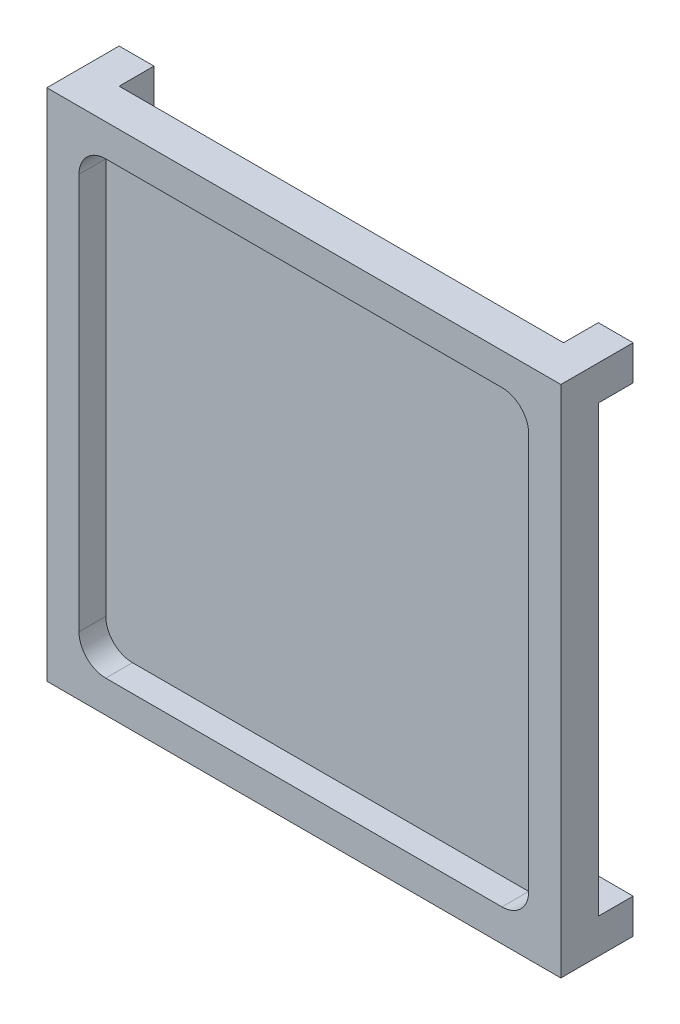
ISO-10303-21;
HEADER;
FILE_DESCRIPTION(('STEP AP214'),'2;1');
FILE_NAME('part.step','',(''),(''),'','','');
FILE_SCHEMA(('AUTOMOTIVE_DESIGN { 1 0 10303 214 1 1 1 1 }'));
ENDSEC;
DATA;
#1=APPLICATION_CONTEXT('core data for automotive mechanical design processes');
#2=APPLICATION_PROTOCOL_DEFINITION('international standard','automotive_design',2000,#1);
#3=PRODUCT_CONTEXT('',#1,'mechanical');
#4=PRODUCT('Part','Part','',(#3));
#5=PRODUCT_RELATED_PRODUCT_CATEGORY('part','',(#4));
#6=PRODUCT_DEFINITION_FORMATION('','',#4);
#7=PRODUCT_DEFINITION_CONTEXT('part definition',#1,'design');
#8=PRODUCT_DEFINITION('design','',#6,#7);
#9=PRODUCT_DEFINITION_SHAPE('','',#8);
#10=(LENGTH_UNIT() NAMED_UNIT(*) SI_UNIT(.MILLI.,.METRE.));
#11=(NAMED_UNIT(*) PLANE_ANGLE_UNIT() SI_UNIT($,.RADIAN.));
#12=(NAMED_UNIT(*) SI_UNIT($,.STERADIAN.) SOLID_ANGLE_UNIT());
#13=UNCERTAINTY_MEASURE_WITH_UNIT(LENGTH_MEASURE(1.E-05),#10,'distance_accuracy_value','');
#14=(GEOMETRIC_REPRESENTATION_CONTEXT(3) GLOBAL_UNCERTAINTY_ASSIGNED_CONTEXT((#13)) GLOBAL_UNIT_ASSIGNED_CONTEXT((#10,
#11,#12)) REPRESENTATION_CONTEXT('',''));
#15=CARTESIAN_POINT('',(0.,0.,0.));
#16=DIRECTION('',(0.,0.,1.));
#17=DIRECTION('',(1.,0.,0.));
#18=AXIS2_PLACEMENT_3D('',#15,#16,#17);
#19=CARTESIAN_POINT('',(0.,0.,0.));
#20=DIRECTION('',(0.,0.,1.));
#21=DIRECTION('',(1.,0.,0.));
#22=AXIS2_PLACEMENT_3D('',#19,#20,#21);
#23=PLANE('',#22);
#24=DIRECTION('',(1.,0.,0.));
#25=VECTOR('',#24,1.);
#26=CARTESIAN_POINT('',(-48.,-41.5,0.));
#27=LINE('',#26,#25);
#28=CARTESIAN_POINT('',(-48.,-41.5,0.));
#29=VERTEX_POINT('',#28);
#30=CARTESIAN_POINT('',(-41.5,-41.5,0.));
#31=VERTEX_POINT('',#30);
#32=EDGE_CURVE('E424',#29,#31,#27,.T.);
#33=ORIENTED_EDGE('',*,*,#32,.F.);
#34=DIRECTION('',(0.,-1.,0.));
#35=VECTOR('',#34,1.);
#36=CARTESIAN_POINT('',(-48.,-48.,0.));
#37=LINE('',#36,#35);
#38=CARTESIAN_POINT('',(-48.,41.5,0.));
#39=VERTEX_POINT('',#38);
#40=EDGE_CURVE('E225',#39,#29,#37,.T.);
#41=ORIENTED_EDGE('',*,*,#40,.F.);
#42=DIRECTION('',(-1.,0.,0.));
#43=VECTOR('',#42,1.);
#44=CARTESIAN_POINT('',(-48.,41.5,0.));
#45=LINE('',#44,#43);
#46=CARTESIAN_POINT('',(-41.5,41.5,0.));
#47=VERTEX_POINT('',#46);
#48=EDGE_CURVE('E255',#47,#39,#45,.T.);
#49=ORIENTED_EDGE('',*,*,#48,.F.);
#50=DIRECTION('',(0.,-1.,0.));
#51=VECTOR('',#50,1.);
#52=CARTESIAN_POINT('',(-41.5,48.,0.));
#53=LINE('',#52,#51);
#54=CARTESIAN_POINT('',(-41.5,48.,0.));
#55=VERTEX_POINT('',#54);
#56=EDGE_CURVE('E250',#55,#47,#53,.T.);
#57=ORIENTED_EDGE('',*,*,#56,.F.);
#58=DIRECTION('',(-1.,0.,0.));
#59=VECTOR('',#58,1.);
#60=CARTESIAN_POINT('',(48.,48.,0.));
#61=LINE('',#60,#59);
#62=CARTESIAN_POINT('',(41.5,48.,0.));
#63=VERTEX_POINT('',#62);
#64=EDGE_CURVE('E369',#63,#55,#61,.T.);
#65=ORIENTED_EDGE('',*,*,#64,.F.);
#66=DIRECTION('',(0.,1.,0.));
#67=VECTOR('',#66,1.);
#68=CARTESIAN_POINT('',(41.5,48.,0.));
#69=LINE('',#68,#67);
#70=CARTESIAN_POINT('',(41.5,41.5,0.));
#71=VERTEX_POINT('',#70);
#72=EDGE_CURVE('E275',#71,#63,#69,.T.);
#73=ORIENTED_EDGE('',*,*,#72,.F.);
#74=DIRECTION('',(-1.,0.,0.));
#75=VECTOR('',#74,1.);
#76=CARTESIAN_POINT('',(48.,41.5,0.));
#77=LINE('',#76,#75);
#78=CARTESIAN_POINT('',(48.,41.5,0.));
#79=VERTEX_POINT('',#78);
#80=EDGE_CURVE('E270',#79,#71,#77,.T.);
#81=ORIENTED_EDGE('',*,*,#80,.F.);
#82=DIRECTION('',(0.,1.,0.));
#83=VECTOR('',#82,1.);
#84=CARTESIAN_POINT('',(48.,-48.,0.));
#85=LINE('',#84,#83);
#86=CARTESIAN_POINT('',(48.,-41.5,0.));
#87=VERTEX_POINT('',#86);
#88=EDGE_CURVE('E367',#87,#79,#85,.T.);
#89=ORIENTED_EDGE('',*,*,#88,.F.);
#90=DIRECTION('',(1.,0.,0.));
#91=VECTOR('',#90,1.);
#92=CARTESIAN_POINT('',(48.,-41.5,0.));
#93=LINE('',#92,#91);
#94=CARTESIAN_POINT('',(41.5,-41.5,0.));
#95=VERTEX_POINT('',#94);
#96=EDGE_CURVE('E228',#95,#87,#93,.T.);
#97=ORIENTED_EDGE('',*,*,#96,.F.);
#98=DIRECTION('',(0.,1.,0.));
#99=VECTOR('',#98,1.);
#100=CARTESIAN_POINT('',(41.5,-48.,0.));
#101=LINE('',#100,#99);
#102=CARTESIAN_POINT('',(41.5,-48.,0.));
#103=VERTEX_POINT('',#102);
#104=EDGE_CURVE('E226',#103,#95,#101,.T.);
#105=ORIENTED_EDGE('',*,*,#104,.F.);
#106=DIRECTION('',(1.,0.,0.));
#107=VECTOR('',#106,1.);
#108=CARTESIAN_POINT('',(48.,-48.,0.));
#109=LINE('',#108,#107);
#110=CARTESIAN_POINT('',(-41.5,-48.,0.));
#111=VERTEX_POINT('',#110);
#112=EDGE_CURVE('E365',#111,#103,#109,.T.);
#113=ORIENTED_EDGE('',*,*,#112,.F.);
#114=DIRECTION('',(0.,-1.,0.));
#115=VECTOR('',#114,1.);
#116=CARTESIAN_POINT('',(-41.5,-48.,0.));
#117=LINE('',#116,#115);
#118=EDGE_CURVE('E220',#31,#111,#117,.T.);
#119=ORIENTED_EDGE('',*,*,#118,.F.);
#120=EDGE_LOOP('',(#33,#41,#49,#57,#65,#73,#81,#89,#97,#105,#113,#119));
#121=FACE_BOUND('',#120,.T.);
#122=ADVANCED_FACE('F41',(#121),#23,.F.);
#123=CARTESIAN_POINT('',(-48.,-48.,2.));
#124=DIRECTION('',(1.,0.,0.));
#125=DIRECTION('',(0.,0.,-1.));
#126=AXIS2_PLACEMENT_3D('',#123,#124,#125);
#127=PLANE('',#126);
#128=DIRECTION('',(0.,0.,-1.));
#129=VECTOR('',#128,1.);
#130=CARTESIAN_POINT('',(-48.,48.,2.));
#131=LINE('',#130,#129);
#132=CARTESIAN_POINT('',(-48.,48.,7.));
#133=VERTEX_POINT('',#132);
#134=CARTESIAN_POINT('',(-48.,48.,-6.5));
#135=VERTEX_POINT('',#134);
#136=EDGE_CURVE('E372',#133,#135,#131,.T.);
#137=ORIENTED_EDGE('',*,*,#136,.T.);
#138=DIRECTION('',(0.,1.,0.));
#139=VECTOR('',#138,1.);
#140=CARTESIAN_POINT('',(-48.,48.,-6.5));
#141=LINE('',#140,#139);
#142=CARTESIAN_POINT('',(-48.,41.5,-6.5));
#143=VERTEX_POINT('',#142);
#144=EDGE_CURVE('E251',#143,#135,#141,.T.);
#145=ORIENTED_EDGE('',*,*,#144,.F.);
#146=DIRECTION('',(0.,0.,1.));
#147=VECTOR('',#146,1.);
#148=CARTESIAN_POINT('',(-48.,41.5,-6.5));
#149=LINE('',#148,#147);
#150=EDGE_CURVE('E261',#143,#39,#149,.T.);
#151=ORIENTED_EDGE('',*,*,#150,.T.);
#152=ORIENTED_EDGE('',*,*,#40,.T.);
#153=DIRECTION('',(0.,0.,1.));
#154=VECTOR('',#153,1.);
#155=CARTESIAN_POINT('',(-48.,-41.5,-6.5));
#156=LINE('',#155,#154);
#157=CARTESIAN_POINT('',(-48.,-41.5,-6.5));
#158=VERTEX_POINT('',#157);
#159=EDGE_CURVE('E206',#158,#29,#156,.T.);
#160=ORIENTED_EDGE('',*,*,#159,.F.);
#161=DIRECTION('',(0.,1.,0.));
#162=VECTOR('',#161,1.);
#163=CARTESIAN_POINT('',(-48.,-48.,-6.5));
#164=LINE('',#163,#162);
#165=CARTESIAN_POINT('',(-48.,-48.,-6.5));
#166=VERTEX_POINT('',#165);
#167=EDGE_CURVE('E213',#166,#158,#164,.T.);
#168=ORIENTED_EDGE('',*,*,#167,.F.);
#169=DIRECTION('',(0.,0.,-1.));
#170=VECTOR('',#169,1.);
#171=CARTESIAN_POINT('',(-48.,-48.,2.));
#172=LINE('',#171,#170);
#173=CARTESIAN_POINT('',(-48.,-48.,7.));
#174=VERTEX_POINT('',#173);
#175=EDGE_CURVE('E11',#174,#166,#172,.T.);
#176=ORIENTED_EDGE('',*,*,#175,.F.);
#177=DIRECTION('',(0.,-1.,0.));
#178=VECTOR('',#177,1.);
#179=CARTESIAN_POINT('',(-48.,48.,7.));
#180=LINE('',#179,#178);
#181=EDGE_CURVE('E355',#133,#174,#180,.T.);
#182=ORIENTED_EDGE('',*,*,#181,.F.);
#183=EDGE_LOOP('',(#137,#145,#151,#152,#160,#168,#176,#182));
#184=FACE_BOUND('',#183,.T.);
#185=ADVANCED_FACE('F43',(#184),#127,.F.);
#186=CARTESIAN_POINT('',(48.,-48.,2.));
#187=DIRECTION('',(0.,1.,0.));
#188=DIRECTION('',(-1.,0.,0.));
#189=AXIS2_PLACEMENT_3D('',#186,#187,#188);
#190=PLANE('',#189);
#191=ORIENTED_EDGE('',*,*,#175,.T.);
#192=DIRECTION('',(-1.,0.,0.));
#193=VECTOR('',#192,1.);
#194=CARTESIAN_POINT('',(-48.,-48.,-6.5));
#195=LINE('',#194,#193);
#196=CARTESIAN_POINT('',(-41.5,-48.,-6.5));
#197=VERTEX_POINT('',#196);
#198=EDGE_CURVE('E218',#197,#166,#195,.T.);
#199=ORIENTED_EDGE('',*,*,#198,.F.);
#200=DIRECTION('',(0.,0.,1.));
#201=VECTOR('',#200,1.);
#202=CARTESIAN_POINT('',(-41.5,-48.,-6.5));
#203=LINE('',#202,#201);
#204=EDGE_CURVE('E56',#197,#111,#203,.T.);
#205=ORIENTED_EDGE('',*,*,#204,.T.);
#206=ORIENTED_EDGE('',*,*,#112,.T.);
#207=DIRECTION('',(0.,0.,1.));
#208=VECTOR('',#207,1.);
#209=CARTESIAN_POINT('',(41.5,-48.,-6.5));
#210=LINE('',#209,#208);
#211=CARTESIAN_POINT('',(41.5,-48.,-6.5));
#212=VERTEX_POINT('',#211);
#213=EDGE_CURVE('E247',#212,#103,#210,.T.);
#214=ORIENTED_EDGE('',*,*,#213,.F.);
#215=DIRECTION('',(-1.,0.,0.));
#216=VECTOR('',#215,1.);
#217=CARTESIAN_POINT('',(48.,-48.,-6.5));
#218=LINE('',#217,#216);
#219=CARTESIAN_POINT('',(48.,-48.,-6.5));
#220=VERTEX_POINT('',#219);
#221=EDGE_CURVE('E236',#220,#212,#218,.T.);
#222=ORIENTED_EDGE('',*,*,#221,.F.);
#223=DIRECTION('',(0.,0.,-1.));
#224=VECTOR('',#223,1.);
#225=CARTESIAN_POINT('',(48.,-48.,2.));
#226=LINE('',#225,#224);
#227=CARTESIAN_POINT('',(48.,-48.,7.));
#228=VERTEX_POINT('',#227);
#229=EDGE_CURVE('E49',#228,#220,#226,.T.);
#230=ORIENTED_EDGE('',*,*,#229,.F.);
#231=DIRECTION('',(1.,0.,0.));
#232=VECTOR('',#231,1.);
#233=CARTESIAN_POINT('',(-48.,-48.,7.));
#234=LINE('',#233,#232);
#235=EDGE_CURVE('E358',#174,#228,#234,.T.);
#236=ORIENTED_EDGE('',*,*,#235,.F.);
#237=EDGE_LOOP('',(#191,#199,#205,#206,#214,#222,#230,#236));
#238=FACE_BOUND('',#237,.T.);
#239=ADVANCED_FACE('F380',(#238),#190,.F.);
#240=CARTESIAN_POINT('',(48.,-48.,2.));
#241=DIRECTION('',(-1.,0.,0.));
#242=DIRECTION('',(0.,0.,1.));
#243=AXIS2_PLACEMENT_3D('',#240,#241,#242);
#244=PLANE('',#243);
#245=ORIENTED_EDGE('',*,*,#229,.T.);
#246=DIRECTION('',(0.,-1.,0.));
#247=VECTOR('',#246,1.);
#248=CARTESIAN_POINT('',(48.,-48.,-6.5));
#249=LINE('',#248,#247);
#250=CARTESIAN_POINT('',(48.,-41.5,-6.5));
#251=VERTEX_POINT('',#250);
#252=EDGE_CURVE('E233',#251,#220,#249,.T.);
#253=ORIENTED_EDGE('',*,*,#252,.F.);
#254=DIRECTION('',(0.,0.,1.));
#255=VECTOR('',#254,1.);
#256=CARTESIAN_POINT('',(48.,-41.5,-6.5));
#257=LINE('',#256,#255);
#258=EDGE_CURVE('E64',#251,#87,#257,.T.);
#259=ORIENTED_EDGE('',*,*,#258,.T.);
#260=ORIENTED_EDGE('',*,*,#88,.T.);
#261=DIRECTION('',(0.,0.,1.));
#262=VECTOR('',#261,1.);
#263=CARTESIAN_POINT('',(48.,41.5,-6.5));
#264=LINE('',#263,#262);
#265=CARTESIAN_POINT('',(48.,41.5,-6.5));
#266=VERTEX_POINT('',#265);
#267=EDGE_CURVE('E292',#266,#79,#264,.T.);
#268=ORIENTED_EDGE('',*,*,#267,.F.);
#269=DIRECTION('',(0.,-1.,0.));
#270=VECTOR('',#269,1.);
#271=CARTESIAN_POINT('',(48.,48.,-6.5));
#272=LINE('',#271,#270);
#273=CARTESIAN_POINT('',(48.,48.,-6.5));
#274=VERTEX_POINT('',#273);
#275=EDGE_CURVE('E271',#274,#266,#272,.T.);
#276=ORIENTED_EDGE('',*,*,#275,.F.);
#277=DIRECTION('',(0.,0.,-1.));
#278=VECTOR('',#277,1.);
#279=CARTESIAN_POINT('',(48.,48.,2.));
#280=LINE('',#279,#278);
#281=CARTESIAN_POINT('',(48.,48.,7.));
#282=VERTEX_POINT('',#281);
#283=EDGE_CURVE('E374',#282,#274,#280,.T.);
#284=ORIENTED_EDGE('',*,*,#283,.F.);
#285=DIRECTION('',(0.,1.,0.));
#286=VECTOR('',#285,1.);
#287=CARTESIAN_POINT('',(48.,-48.,7.));
#288=LINE('',#287,#286);
#289=EDGE_CURVE('E361',#228,#282,#288,.T.);
#290=ORIENTED_EDGE('',*,*,#289,.F.);
#291=EDGE_LOOP('',(#245,#253,#259,#260,#268,#276,#284,#290));
#292=FACE_BOUND('',#291,.T.);
#293=ADVANCED_FACE('F377',(#292),#244,.F.);
#294=CARTESIAN_POINT('',(48.,48.,2.));
#295=DIRECTION('',(0.,-1.,0.));
#296=DIRECTION('',(1.,0.,0.));
#297=AXIS2_PLACEMENT_3D('',#294,#295,#296);
#298=PLANE('',#297);
#299=ORIENTED_EDGE('',*,*,#283,.T.);
#300=DIRECTION('',(1.,0.,0.));
#301=VECTOR('',#300,1.);
#302=CARTESIAN_POINT('',(48.,48.,-6.5));
#303=LINE('',#302,#301);
#304=CARTESIAN_POINT('',(41.5,48.,-6.5));
#305=VERTEX_POINT('',#304);
#306=EDGE_CURVE('E279',#305,#274,#303,.T.);
#307=ORIENTED_EDGE('',*,*,#306,.F.);
#308=DIRECTION('',(0.,0.,1.));
#309=VECTOR('',#308,1.);
#310=CARTESIAN_POINT('',(41.5,48.,-6.5));
#311=LINE('',#310,#309);
#312=EDGE_CURVE('E282',#305,#63,#311,.T.);
#313=ORIENTED_EDGE('',*,*,#312,.T.);
#314=ORIENTED_EDGE('',*,*,#64,.T.);
#315=DIRECTION('',(0.,0.,1.));
#316=VECTOR('',#315,1.);
#317=CARTESIAN_POINT('',(-41.5,48.,-6.5));
#318=LINE('',#317,#316);
#319=CARTESIAN_POINT('',(-41.5,48.,-6.5));
#320=VERTEX_POINT('',#319);
#321=EDGE_CURVE('E268',#320,#55,#318,.T.);
#322=ORIENTED_EDGE('',*,*,#321,.F.);
#323=DIRECTION('',(1.,0.,0.));
#324=VECTOR('',#323,1.);
#325=CARTESIAN_POINT('',(-48.,48.,-6.5));
#326=LINE('',#325,#324);
#327=EDGE_CURVE('E254',#135,#320,#326,.T.);
#328=ORIENTED_EDGE('',*,*,#327,.F.);
#329=ORIENTED_EDGE('',*,*,#136,.F.);
#330=DIRECTION('',(-1.,0.,0.));
#331=VECTOR('',#330,1.);
#332=CARTESIAN_POINT('',(48.,48.,7.));
#333=LINE('',#332,#331);
#334=EDGE_CURVE('E352',#282,#133,#333,.T.);
#335=ORIENTED_EDGE('',*,*,#334,.F.);
#336=EDGE_LOOP('',(#299,#307,#313,#314,#322,#328,#329,#335));
#337=FACE_BOUND('',#336,.T.);
#338=ADVANCED_FACE('F404',(#337),#298,.F.);
#339=CARTESIAN_POINT('',(0.,0.,7.));
#340=DIRECTION('',(0.,0.,1.));
#341=DIRECTION('',(1.,0.,0.));
#342=AXIS2_PLACEMENT_3D('',#339,#340,#341);
#343=PLANE('',#342);
#344=ORIENTED_EDGE('',*,*,#334,.T.);
#345=ORIENTED_EDGE('',*,*,#181,.T.);
#346=ORIENTED_EDGE('',*,*,#235,.T.);
#347=ORIENTED_EDGE('',*,*,#289,.T.);
#348=EDGE_LOOP('',(#344,#345,#346,#347));
#349=FACE_BOUND('',#348,.T.);
#350=DIRECTION('',(1.,0.,0.));
#351=VECTOR('',#350,1.);
#352=CARTESIAN_POINT('',(37.,-42.,7.));
#353=LINE('',#352,#351);
#354=CARTESIAN_POINT('',(-37.,-42.,7.));
#355=VERTEX_POINT('',#354);
#356=CARTESIAN_POINT('',(37.,-42.,7.));
#357=VERTEX_POINT('',#356);
#358=EDGE_CURVE('E298',#355,#357,#353,.T.);
#359=ORIENTED_EDGE('',*,*,#358,.F.);
#360=CARTESIAN_POINT('',(-37.,-37.,7.));
#361=DIRECTION('',(0.,0.,1.));
#362=DIRECTION('',(-1.,0.,0.));
#363=AXIS2_PLACEMENT_3D('',#360,#361,#362);
#364=CIRCLE('',#363,5.);
#365=CARTESIAN_POINT('',(-42.,-37.,7.));
#366=VERTEX_POINT('',#365);
#367=EDGE_CURVE('E296',#366,#355,#364,.T.);
#368=ORIENTED_EDGE('',*,*,#367,.F.);
#369=DIRECTION('',(0.,-1.,0.));
#370=VECTOR('',#369,1.);
#371=CARTESIAN_POINT('',(-42.,-37.,7.));
#372=LINE('',#371,#370);
#373=CARTESIAN_POINT('',(-42.,37.,7.));
#374=VERTEX_POINT('',#373);
#375=EDGE_CURVE('E312',#374,#366,#372,.T.);
#376=ORIENTED_EDGE('',*,*,#375,.F.);
#377=CARTESIAN_POINT('',(-37.,37.,7.));
#378=DIRECTION('',(0.,0.,1.));
#379=DIRECTION('',(1.,0.,0.));
#380=AXIS2_PLACEMENT_3D('',#377,#378,#379);
#381=CIRCLE('',#380,5.);
#382=CARTESIAN_POINT('',(-37.,42.,7.));
#383=VERTEX_POINT('',#382);
#384=EDGE_CURVE('E309',#383,#374,#381,.T.);
#385=ORIENTED_EDGE('',*,*,#384,.F.);
#386=DIRECTION('',(-1.,0.,0.));
#387=VECTOR('',#386,1.);
#388=CARTESIAN_POINT('',(37.,42.,7.));
#389=LINE('',#388,#387);
#390=CARTESIAN_POINT('',(37.,42.,7.));
#391=VERTEX_POINT('',#390);
#392=EDGE_CURVE('E307',#391,#383,#389,.T.);
#393=ORIENTED_EDGE('',*,*,#392,.F.);
#394=CARTESIAN_POINT('',(37.,37.,7.));
#395=DIRECTION('',(0.,0.,1.));
#396=DIRECTION('',(1.,0.,0.));
#397=AXIS2_PLACEMENT_3D('',#394,#395,#396);
#398=CIRCLE('',#397,5.);
#399=CARTESIAN_POINT('',(42.,37.,7.));
#400=VERTEX_POINT('',#399);
#401=EDGE_CURVE('E305',#400,#391,#398,.T.);
#402=ORIENTED_EDGE('',*,*,#401,.F.);
#403=DIRECTION('',(0.,1.,0.));
#404=VECTOR('',#403,1.);
#405=CARTESIAN_POINT('',(42.,-37.,7.));
#406=LINE('',#405,#404);
#407=CARTESIAN_POINT('',(42.,-37.,7.));
#408=VERTEX_POINT('',#407);
#409=EDGE_CURVE('E303',#408,#400,#406,.T.);
#410=ORIENTED_EDGE('',*,*,#409,.F.);
#411=CARTESIAN_POINT('',(37.,-37.,7.));
#412=DIRECTION('',(0.,0.,1.));
#413=DIRECTION('',(1.,0.,0.));
#414=AXIS2_PLACEMENT_3D('',#411,#412,#413);
#415=CIRCLE('',#414,5.);
#416=EDGE_CURVE('E301',#357,#408,#415,.T.);
#417=ORIENTED_EDGE('',*,*,#416,.F.);
#418=EDGE_LOOP('',(#359,#368,#376,#385,#393,#402,#410,#417));
#419=FACE_BOUND('',#418,.T.);
#420=ADVANCED_FACE('F407',(#349,#419),#343,.T.);
#421=CARTESIAN_POINT('',(-37.,-37.,7.));
#422=DIRECTION('',(0.,0.,-1.));
#423=DIRECTION('',(-1.,0.,0.));
#424=AXIS2_PLACEMENT_3D('',#421,#422,#423);
#425=CYLINDRICAL_SURFACE('',#424,5.);
#426=CARTESIAN_POINT('',(-37.,-37.,2.));
#427=DIRECTION('',(0.,0.,1.));
#428=DIRECTION('',(-1.,0.,0.));
#429=AXIS2_PLACEMENT_3D('',#426,#427,#428);
#430=CIRCLE('',#429,5.);
#431=CARTESIAN_POINT('',(-42.,-37.,2.));
#432=VERTEX_POINT('',#431);
#433=CARTESIAN_POINT('',(-37.,-42.,2.));
#434=VERTEX_POINT('',#433);
#435=EDGE_CURVE('E295',#432,#434,#430,.T.);
#436=ORIENTED_EDGE('',*,*,#435,.F.);
#437=DIRECTION('',(0.,0.,-1.));
#438=VECTOR('',#437,1.);
#439=CARTESIAN_POINT('',(-42.,-37.,7.));
#440=LINE('',#439,#438);
#441=EDGE_CURVE('E314',#366,#432,#440,.T.);
#442=ORIENTED_EDGE('',*,*,#441,.F.);
#443=ORIENTED_EDGE('',*,*,#367,.T.);
#444=DIRECTION('',(0.,0.,-1.));
#445=VECTOR('',#444,1.);
#446=CARTESIAN_POINT('',(-37.,-42.,7.));
#447=LINE('',#446,#445);
#448=EDGE_CURVE('E349',#355,#434,#447,.T.);
#449=ORIENTED_EDGE('',*,*,#448,.T.);
#450=EDGE_LOOP('',(#436,#442,#443,#449));
#451=FACE_BOUND('',#450,.T.);
#452=ADVANCED_FACE('F470',(#451),#425,.F.);
#453=CARTESIAN_POINT('',(37.,-42.,7.));
#454=DIRECTION('',(0.,1.,0.));
#455=DIRECTION('',(0.,0.,1.));
#456=AXIS2_PLACEMENT_3D('',#453,#454,#455);
#457=PLANE('',#456);
#458=DIRECTION('',(1.,0.,0.));
#459=VECTOR('',#458,1.);
#460=CARTESIAN_POINT('',(37.,-42.,2.));
#461=LINE('',#460,#459);
#462=CARTESIAN_POINT('',(37.,-42.,2.));
#463=VERTEX_POINT('',#462);
#464=EDGE_CURVE('E316',#434,#463,#461,.T.);
#465=ORIENTED_EDGE('',*,*,#464,.F.);
#466=ORIENTED_EDGE('',*,*,#448,.F.);
#467=ORIENTED_EDGE('',*,*,#358,.T.);
#468=DIRECTION('',(0.,0.,-1.));
#469=VECTOR('',#468,1.);
#470=CARTESIAN_POINT('',(37.,-42.,7.));
#471=LINE('',#470,#469);
#472=EDGE_CURVE('E346',#357,#463,#471,.T.);
#473=ORIENTED_EDGE('',*,*,#472,.T.);
#474=EDGE_LOOP('',(#465,#466,#467,#473));
#475=FACE_BOUND('',#474,.T.);
#476=ADVANCED_FACE('F475',(#475),#457,.T.);
#477=CARTESIAN_POINT('',(37.,-37.,7.));
#478=DIRECTION('',(0.,0.,-1.));
#479=DIRECTION('',(-1.,0.,0.));
#480=AXIS2_PLACEMENT_3D('',#477,#478,#479);
#481=CYLINDRICAL_SURFACE('',#480,5.);
#482=CARTESIAN_POINT('',(37.,-37.,2.));
#483=DIRECTION('',(0.,0.,1.));
#484=DIRECTION('',(1.,0.,0.));
#485=AXIS2_PLACEMENT_3D('',#482,#483,#484);
#486=CIRCLE('',#485,5.);
#487=CARTESIAN_POINT('',(42.,-37.,2.));
#488=VERTEX_POINT('',#487);
#489=EDGE_CURVE('E318',#463,#488,#486,.T.);
#490=ORIENTED_EDGE('',*,*,#489,.F.);
#491=ORIENTED_EDGE('',*,*,#472,.F.);
#492=ORIENTED_EDGE('',*,*,#416,.T.);
#493=DIRECTION('',(0.,0.,-1.));
#494=VECTOR('',#493,1.);
#495=CARTESIAN_POINT('',(42.,-37.,7.));
#496=LINE('',#495,#494);
#497=EDGE_CURVE('E343',#408,#488,#496,.T.);
#498=ORIENTED_EDGE('',*,*,#497,.T.);
#499=EDGE_LOOP('',(#490,#491,#492,#498));
#500=FACE_BOUND('',#499,.T.);
#501=ADVANCED_FACE('F482',(#500),#481,.F.);
#502=CARTESIAN_POINT('',(42.,-37.,7.));
#503=DIRECTION('',(-1.,0.,0.));
#504=DIRECTION('',(0.,0.,1.));
#505=AXIS2_PLACEMENT_3D('',#502,#503,#504);
#506=PLANE('',#505);
#507=DIRECTION('',(0.,1.,0.));
#508=VECTOR('',#507,1.);
#509=CARTESIAN_POINT('',(42.,-37.,2.));
#510=LINE('',#509,#508);
#511=CARTESIAN_POINT('',(42.,37.,2.));
#512=VERTEX_POINT('',#511);
#513=EDGE_CURVE('E320',#488,#512,#510,.T.);
#514=ORIENTED_EDGE('',*,*,#513,.F.);
#515=ORIENTED_EDGE('',*,*,#497,.F.);
#516=ORIENTED_EDGE('',*,*,#409,.T.);
#517=DIRECTION('',(0.,0.,-1.));
#518=VECTOR('',#517,1.);
#519=CARTESIAN_POINT('',(42.,37.,7.));
#520=LINE('',#519,#518);
#521=EDGE_CURVE('E340',#400,#512,#520,.T.);
#522=ORIENTED_EDGE('',*,*,#521,.T.);
#523=EDGE_LOOP('',(#514,#515,#516,#522));
#524=FACE_BOUND('',#523,.T.);
#525=ADVANCED_FACE('F489',(#524),#506,.T.);
#526=CARTESIAN_POINT('',(37.,37.,7.));
#527=DIRECTION('',(0.,0.,-1.));
#528=DIRECTION('',(-1.,0.,0.));
#529=AXIS2_PLACEMENT_3D('',#526,#527,#528);
#530=CYLINDRICAL_SURFACE('',#529,5.);
#531=CARTESIAN_POINT('',(37.,37.,2.));
#532=DIRECTION('',(0.,0.,1.));
#533=DIRECTION('',(1.,0.,0.));
#534=AXIS2_PLACEMENT_3D('',#531,#532,#533);
#535=CIRCLE('',#534,5.);
#536=CARTESIAN_POINT('',(37.,42.,2.));
#537=VERTEX_POINT('',#536);
#538=EDGE_CURVE('E322',#512,#537,#535,.T.);
#539=ORIENTED_EDGE('',*,*,#538,.F.);
#540=ORIENTED_EDGE('',*,*,#521,.F.);
#541=ORIENTED_EDGE('',*,*,#401,.T.);
#542=DIRECTION('',(0.,0.,-1.));
#543=VECTOR('',#542,1.);
#544=CARTESIAN_POINT('',(37.,42.,7.));
#545=LINE('',#544,#543);
#546=EDGE_CURVE('E337',#391,#537,#545,.T.);
#547=ORIENTED_EDGE('',*,*,#546,.T.);
#548=EDGE_LOOP('',(#539,#540,#541,#547));
#549=FACE_BOUND('',#548,.T.);
#550=ADVANCED_FACE('F496',(#549),#530,.F.);
#551=CARTESIAN_POINT('',(37.,42.,7.));
#552=DIRECTION('',(0.,-1.,0.));
#553=DIRECTION('',(0.,0.,-1.));
#554=AXIS2_PLACEMENT_3D('',#551,#552,#553);
#555=PLANE('',#554);
#556=DIRECTION('',(-1.,0.,0.));
#557=VECTOR('',#556,1.);
#558=CARTESIAN_POINT('',(37.,42.,2.));
#559=LINE('',#558,#557);
#560=CARTESIAN_POINT('',(-37.,42.,2.));
#561=VERTEX_POINT('',#560);
#562=EDGE_CURVE('E324',#537,#561,#559,.T.);
#563=ORIENTED_EDGE('',*,*,#562,.F.);
#564=ORIENTED_EDGE('',*,*,#546,.F.);
#565=ORIENTED_EDGE('',*,*,#392,.T.);
#566=DIRECTION('',(0.,0.,-1.));
#567=VECTOR('',#566,1.);
#568=CARTESIAN_POINT('',(-37.,42.,7.));
#569=LINE('',#568,#567);
#570=EDGE_CURVE('E334',#383,#561,#569,.T.);
#571=ORIENTED_EDGE('',*,*,#570,.T.);
#572=EDGE_LOOP('',(#563,#564,#565,#571));
#573=FACE_BOUND('',#572,.T.);
#574=ADVANCED_FACE('F503',(#573),#555,.T.);
#575=CARTESIAN_POINT('',(-37.,37.,7.));
#576=DIRECTION('',(0.,0.,-1.));
#577=DIRECTION('',(-1.,0.,0.));
#578=AXIS2_PLACEMENT_3D('',#575,#576,#577);
#579=CYLINDRICAL_SURFACE('',#578,5.);
#580=CARTESIAN_POINT('',(-37.,37.,2.));
#581=DIRECTION('',(0.,0.,1.));
#582=DIRECTION('',(1.,0.,0.));
#583=AXIS2_PLACEMENT_3D('',#580,#581,#582);
#584=CIRCLE('',#583,5.);
#585=CARTESIAN_POINT('',(-42.,37.,2.));
#586=VERTEX_POINT('',#585);
#587=EDGE_CURVE('E326',#561,#586,#584,.T.);
#588=ORIENTED_EDGE('',*,*,#587,.F.);
#589=ORIENTED_EDGE('',*,*,#570,.F.);
#590=ORIENTED_EDGE('',*,*,#384,.T.);
#591=DIRECTION('',(0.,0.,-1.));
#592=VECTOR('',#591,1.);
#593=CARTESIAN_POINT('',(-42.,37.,7.));
#594=LINE('',#593,#592);
#595=EDGE_CURVE('E331',#374,#586,#594,.T.);
#596=ORIENTED_EDGE('',*,*,#595,.T.);
#597=EDGE_LOOP('',(#588,#589,#590,#596));
#598=FACE_BOUND('',#597,.T.);
#599=ADVANCED_FACE('F510',(#598),#579,.F.);
#600=CARTESIAN_POINT('',(-42.,-37.,7.));
#601=DIRECTION('',(1.,0.,0.));
#602=DIRECTION('',(0.,0.,-1.));
#603=AXIS2_PLACEMENT_3D('',#600,#601,#602);
#604=PLANE('',#603);
#605=DIRECTION('',(0.,-1.,0.));
#606=VECTOR('',#605,1.);
#607=CARTESIAN_POINT('',(-42.,-37.,2.));
#608=LINE('',#607,#606);
#609=EDGE_CURVE('E299',#586,#432,#608,.T.);
#610=ORIENTED_EDGE('',*,*,#609,.F.);
#611=ORIENTED_EDGE('',*,*,#595,.F.);
#612=ORIENTED_EDGE('',*,*,#375,.T.);
#613=ORIENTED_EDGE('',*,*,#441,.T.);
#614=EDGE_LOOP('',(#610,#611,#612,#613));
#615=FACE_BOUND('',#614,.T.);
#616=ADVANCED_FACE('F517',(#615),#604,.T.);
#617=CARTESIAN_POINT('',(0.,0.,2.));
#618=DIRECTION('',(0.,0.,1.));
#619=DIRECTION('',(1.,0.,0.));
#620=AXIS2_PLACEMENT_3D('',#617,#618,#619);
#621=PLANE('',#620);
#622=ORIENTED_EDGE('',*,*,#435,.T.);
#623=ORIENTED_EDGE('',*,*,#464,.T.);
#624=ORIENTED_EDGE('',*,*,#489,.T.);
#625=ORIENTED_EDGE('',*,*,#513,.T.);
#626=ORIENTED_EDGE('',*,*,#538,.T.);
#627=ORIENTED_EDGE('',*,*,#562,.T.);
#628=ORIENTED_EDGE('',*,*,#587,.T.);
#629=ORIENTED_EDGE('',*,*,#609,.T.);
#630=EDGE_LOOP('',(#622,#623,#624,#625,#626,#627,#628,#629));
#631=FACE_BOUND('',#630,.T.);
#632=ADVANCED_FACE('F449',(#631),#621,.T.);
#633=CARTESIAN_POINT('',(48.,41.5,-6.5));
#634=DIRECTION('',(0.,1.,0.));
#635=DIRECTION('',(0.,0.,1.));
#636=AXIS2_PLACEMENT_3D('',#633,#634,#635);
#637=PLANE('',#636);
#638=ORIENTED_EDGE('',*,*,#80,.T.);
#639=DIRECTION('',(0.,0.,1.));
#640=VECTOR('',#639,1.);
#641=CARTESIAN_POINT('',(41.5,41.5,-6.5));
#642=LINE('',#641,#640);
#643=CARTESIAN_POINT('',(41.5,41.5,-6.5));
#644=VERTEX_POINT('',#643);
#645=EDGE_CURVE('E289',#644,#71,#642,.T.);
#646=ORIENTED_EDGE('',*,*,#645,.F.);
#647=DIRECTION('',(-1.,0.,0.));
#648=VECTOR('',#647,1.);
#649=CARTESIAN_POINT('',(48.,41.5,-6.5));
#650=LINE('',#649,#648);
#651=EDGE_CURVE('E274',#266,#644,#650,.T.);
#652=ORIENTED_EDGE('',*,*,#651,.F.);
#653=ORIENTED_EDGE('',*,*,#267,.T.);
#654=EDGE_LOOP('',(#638,#646,#652,#653));
#655=FACE_BOUND('',#654,.T.);
#656=ADVANCED_FACE('F396',(#655),#637,.F.);
#657=CARTESIAN_POINT('',(41.5,48.,-6.5));
#658=DIRECTION('',(1.,0.,0.));
#659=DIRECTION('',(0.,0.,-1.));
#660=AXIS2_PLACEMENT_3D('',#657,#658,#659);
#661=PLANE('',#660);
#662=ORIENTED_EDGE('',*,*,#72,.T.);
#663=ORIENTED_EDGE('',*,*,#312,.F.);
#664=DIRECTION('',(0.,1.,0.));
#665=VECTOR('',#664,1.);
#666=CARTESIAN_POINT('',(41.5,48.,-6.5));
#667=LINE('',#666,#665);
#668=EDGE_CURVE('E277',#644,#305,#667,.T.);
#669=ORIENTED_EDGE('',*,*,#668,.F.);
#670=ORIENTED_EDGE('',*,*,#645,.T.);
#671=EDGE_LOOP('',(#662,#663,#669,#670));
#672=FACE_BOUND('',#671,.T.);
#673=ADVANCED_FACE('F535',(#672),#661,.F.);
#674=CARTESIAN_POINT('',(0.,0.,-6.5));
#675=DIRECTION('',(0.,0.,-1.));
#676=DIRECTION('',(-1.,0.,0.));
#677=AXIS2_PLACEMENT_3D('',#674,#675,#676);
#678=PLANE('',#677);
#679=ORIENTED_EDGE('',*,*,#275,.T.);
#680=ORIENTED_EDGE('',*,*,#651,.T.);
#681=ORIENTED_EDGE('',*,*,#668,.T.);
#682=ORIENTED_EDGE('',*,*,#306,.T.);
#683=EDGE_LOOP('',(#679,#680,#681,#682));
#684=FACE_BOUND('',#683,.T.);
#685=ADVANCED_FACE('F400',(#684),#678,.T.);
#686=CARTESIAN_POINT('',(-41.5,48.,-6.5));
#687=DIRECTION('',(-1.,0.,0.));
#688=DIRECTION('',(0.,0.,1.));
#689=AXIS2_PLACEMENT_3D('',#686,#687,#688);
#690=PLANE('',#689);
#691=ORIENTED_EDGE('',*,*,#56,.T.);
#692=DIRECTION('',(0.,0.,1.));
#693=VECTOR('',#692,1.);
#694=CARTESIAN_POINT('',(-41.5,41.5,-6.5));
#695=LINE('',#694,#693);
#696=CARTESIAN_POINT('',(-41.5,41.5,-6.5));
#697=VERTEX_POINT('',#696);
#698=EDGE_CURVE('E265',#697,#47,#695,.T.);
#699=ORIENTED_EDGE('',*,*,#698,.F.);
#700=DIRECTION('',(0.,-1.,0.));
#701=VECTOR('',#700,1.);
#702=CARTESIAN_POINT('',(-41.5,48.,-6.5));
#703=LINE('',#702,#701);
#704=EDGE_CURVE('E257',#320,#697,#703,.T.);
#705=ORIENTED_EDGE('',*,*,#704,.F.);
#706=ORIENTED_EDGE('',*,*,#321,.T.);
#707=EDGE_LOOP('',(#691,#699,#705,#706));
#708=FACE_BOUND('',#707,.T.);
#709=ADVANCED_FACE('F547',(#708),#690,.F.);
#710=CARTESIAN_POINT('',(-48.,41.5,-6.5));
#711=DIRECTION('',(0.,1.,0.));
#712=DIRECTION('',(0.,0.,1.));
#713=AXIS2_PLACEMENT_3D('',#710,#711,#712);
#714=PLANE('',#713);
#715=ORIENTED_EDGE('',*,*,#48,.T.);
#716=ORIENTED_EDGE('',*,*,#150,.F.);
#717=DIRECTION('',(-1.,0.,0.));
#718=VECTOR('',#717,1.);
#719=CARTESIAN_POINT('',(-48.,41.5,-6.5));
#720=LINE('',#719,#718);
#721=EDGE_CURVE('E259',#697,#143,#720,.T.);
#722=ORIENTED_EDGE('',*,*,#721,.F.);
#723=ORIENTED_EDGE('',*,*,#698,.T.);
#724=EDGE_LOOP('',(#715,#716,#722,#723));
#725=FACE_BOUND('',#724,.T.);
#726=ADVANCED_FACE('F420',(#725),#714,.F.);
#727=CARTESIAN_POINT('',(0.,0.,-6.5));
#728=DIRECTION('',(0.,0.,1.));
#729=DIRECTION('',(1.,0.,0.));
#730=AXIS2_PLACEMENT_3D('',#727,#728,#729);
#731=PLANE('',#730);
#732=ORIENTED_EDGE('',*,*,#144,.T.);
#733=ORIENTED_EDGE('',*,*,#327,.T.);
#734=ORIENTED_EDGE('',*,*,#704,.T.);
#735=ORIENTED_EDGE('',*,*,#721,.T.);
#736=EDGE_LOOP('',(#732,#733,#734,#735));
#737=FACE_BOUND('',#736,.T.);
#738=ADVANCED_FACE('F415',(#737),#731,.F.);
#739=CARTESIAN_POINT('',(41.5,-48.,-6.5));
#740=DIRECTION('',(1.,0.,0.));
#741=DIRECTION('',(0.,0.,-1.));
#742=AXIS2_PLACEMENT_3D('',#739,#740,#741);
#743=PLANE('',#742);
#744=ORIENTED_EDGE('',*,*,#104,.T.);
#745=DIRECTION('',(0.,0.,1.));
#746=VECTOR('',#745,1.);
#747=CARTESIAN_POINT('',(41.5,-41.5,-6.5));
#748=LINE('',#747,#746);
#749=CARTESIAN_POINT('',(41.5,-41.5,-6.5));
#750=VERTEX_POINT('',#749);
#751=EDGE_CURVE('E244',#750,#95,#748,.T.);
#752=ORIENTED_EDGE('',*,*,#751,.F.);
#753=DIRECTION('',(0.,1.,0.));
#754=VECTOR('',#753,1.);
#755=CARTESIAN_POINT('',(41.5,-48.,-6.5));
#756=LINE('',#755,#754);
#757=EDGE_CURVE('E238',#212,#750,#756,.T.);
#758=ORIENTED_EDGE('',*,*,#757,.F.);
#759=ORIENTED_EDGE('',*,*,#213,.T.);
#760=EDGE_LOOP('',(#744,#752,#758,#759));
#761=FACE_BOUND('',#760,.T.);
#762=ADVANCED_FACE('F433',(#761),#743,.F.);
#763=CARTESIAN_POINT('',(48.,-41.5,-6.5));
#764=DIRECTION('',(0.,-1.,0.));
#765=DIRECTION('',(0.,0.,-1.));
#766=AXIS2_PLACEMENT_3D('',#763,#764,#765);
#767=PLANE('',#766);
#768=ORIENTED_EDGE('',*,*,#96,.T.);
#769=ORIENTED_EDGE('',*,*,#258,.F.);
#770=DIRECTION('',(1.,0.,0.));
#771=VECTOR('',#770,1.);
#772=CARTESIAN_POINT('',(48.,-41.5,-6.5));
#773=LINE('',#772,#771);
#774=EDGE_CURVE('E240',#750,#251,#773,.T.);
#775=ORIENTED_EDGE('',*,*,#774,.F.);
#776=ORIENTED_EDGE('',*,*,#751,.T.);
#777=EDGE_LOOP('',(#768,#769,#775,#776));
#778=FACE_BOUND('',#777,.T.);
#779=ADVANCED_FACE('F387',(#778),#767,.F.);
#780=CARTESIAN_POINT('',(0.,0.,-6.5));
#781=DIRECTION('',(0.,0.,1.));
#782=DIRECTION('',(1.,0.,0.));
#783=AXIS2_PLACEMENT_3D('',#780,#781,#782);
#784=PLANE('',#783);
#785=ORIENTED_EDGE('',*,*,#252,.T.);
#786=ORIENTED_EDGE('',*,*,#221,.T.);
#787=ORIENTED_EDGE('',*,*,#757,.T.);
#788=ORIENTED_EDGE('',*,*,#774,.T.);
#789=EDGE_LOOP('',(#785,#786,#787,#788));
#790=FACE_BOUND('',#789,.T.);
#791=ADVANCED_FACE('F383',(#790),#784,.F.);
#792=CARTESIAN_POINT('',(-48.,-41.5,-6.5));
#793=DIRECTION('',(0.,-1.,0.));
#794=DIRECTION('',(0.,0.,-1.));
#795=AXIS2_PLACEMENT_3D('',#792,#793,#794);
#796=PLANE('',#795);
#797=ORIENTED_EDGE('',*,*,#32,.T.);
#798=DIRECTION('',(0.,0.,1.));
#799=VECTOR('',#798,1.);
#800=CARTESIAN_POINT('',(-41.5,-41.5,-6.5));
#801=LINE('',#800,#799);
#802=CARTESIAN_POINT('',(-41.5,-41.5,-6.5));
#803=VERTEX_POINT('',#802);
#804=EDGE_CURVE('E209',#803,#31,#801,.T.);
#805=ORIENTED_EDGE('',*,*,#804,.F.);
#806=DIRECTION('',(1.,0.,0.));
#807=VECTOR('',#806,1.);
#808=CARTESIAN_POINT('',(-48.,-41.5,-6.5));
#809=LINE('',#808,#807);
#810=EDGE_CURVE('E202',#158,#803,#809,.T.);
#811=ORIENTED_EDGE('',*,*,#810,.F.);
#812=ORIENTED_EDGE('',*,*,#159,.T.);
#813=EDGE_LOOP('',(#797,#805,#811,#812));
#814=FACE_BOUND('',#813,.T.);
#815=ADVANCED_FACE('F204',(#814),#796,.F.);
#816=CARTESIAN_POINT('',(-41.5,-48.,-6.5));
#817=DIRECTION('',(-1.,0.,0.));
#818=DIRECTION('',(0.,0.,1.));
#819=AXIS2_PLACEMENT_3D('',#816,#817,#818);
#820=PLANE('',#819);
#821=ORIENTED_EDGE('',*,*,#118,.T.);
#822=ORIENTED_EDGE('',*,*,#204,.F.);
#823=DIRECTION('',(0.,-1.,0.));
#824=VECTOR('',#823,1.);
#825=CARTESIAN_POINT('',(-41.5,-48.,-6.5));
#826=LINE('',#825,#824);
#827=EDGE_CURVE('E212',#803,#197,#826,.T.);
#828=ORIENTED_EDGE('',*,*,#827,.F.);
#829=ORIENTED_EDGE('',*,*,#804,.T.);
#830=EDGE_LOOP('',(#821,#822,#828,#829));
#831=FACE_BOUND('',#830,.T.);
#832=ADVANCED_FACE('F431',(#831),#820,.F.);
#833=CARTESIAN_POINT('',(0.,0.,-6.5));
#834=DIRECTION('',(0.,0.,-1.));
#835=DIRECTION('',(-1.,0.,0.));
#836=AXIS2_PLACEMENT_3D('',#833,#834,#835);
#837=PLANE('',#836);
#838=ORIENTED_EDGE('',*,*,#167,.T.);
#839=ORIENTED_EDGE('',*,*,#810,.T.);
#840=ORIENTED_EDGE('',*,*,#827,.T.);
#841=ORIENTED_EDGE('',*,*,#198,.T.);
#842=EDGE_LOOP('',(#838,#839,#840,#841));
#843=FACE_BOUND('',#842,.T.);
#844=ADVANCED_FACE('F217',(#843),#837,.T.);
#845=CLOSED_SHELL('',(#122,#185,#239,#293,#338,#420,#452,#476,#501,#525,#550,#574,#599,#616,
#632,#656,#673,#685,#709,#726,#738,#762,#779,#791,#815,#832,#844));
#846=MANIFOLD_SOLID_BREP('B2',#845);
#847=ADVANCED_BREP_SHAPE_REPRESENTATION('',(#18,#846),#14);
#848=SHAPE_DEFINITION_REPRESENTATION(#9,#847);
ENDSEC;
END-ISO-10303-21;
